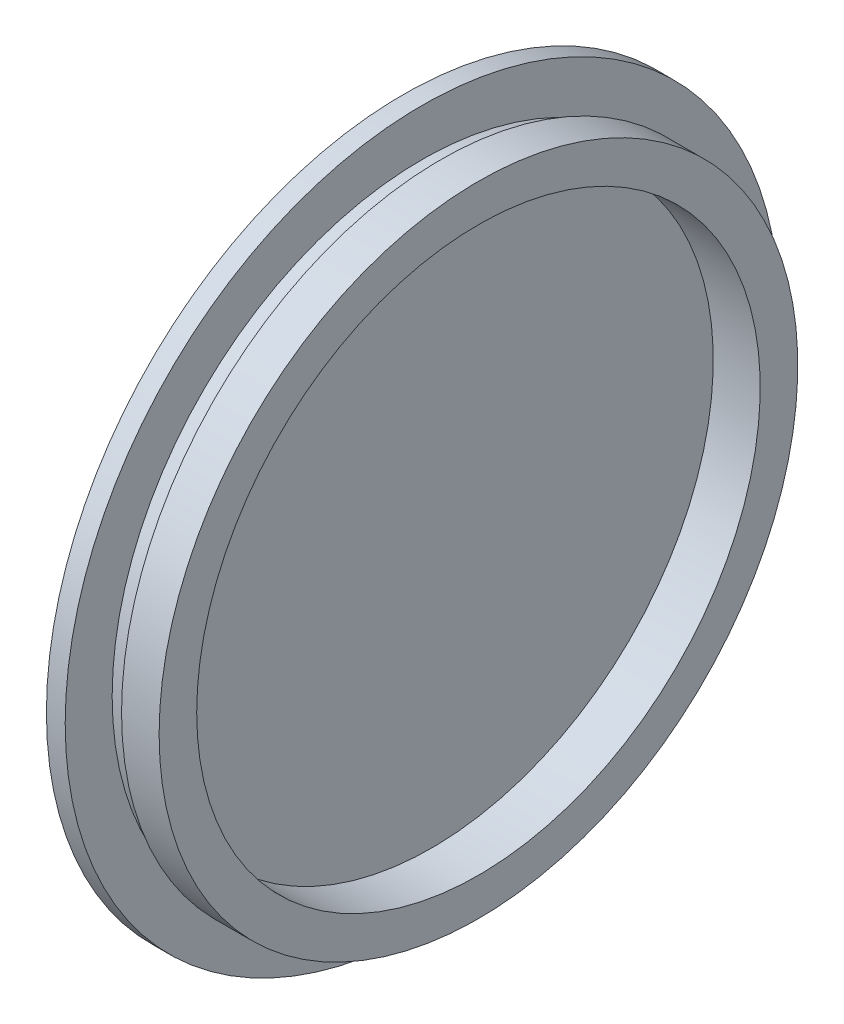
ISO-10303-21;
HEADER;
FILE_DESCRIPTION(('STEP AP214'),'2;1');
FILE_NAME('part.step','',(''),(''),'','','');
FILE_SCHEMA(('AUTOMOTIVE_DESIGN { 1 0 10303 214 1 1 1 1 }'));
ENDSEC;
DATA;
#1=APPLICATION_CONTEXT('core data for automotive mechanical design processes');
#2=APPLICATION_PROTOCOL_DEFINITION('international standard','automotive_design',2000,#1);
#3=PRODUCT_CONTEXT('',#1,'mechanical');
#4=PRODUCT('Part','Part','',(#3));
#5=PRODUCT_RELATED_PRODUCT_CATEGORY('part','',(#4));
#6=PRODUCT_DEFINITION_FORMATION('','',#4);
#7=PRODUCT_DEFINITION_CONTEXT('part definition',#1,'design');
#8=PRODUCT_DEFINITION('design','',#6,#7);
#9=PRODUCT_DEFINITION_SHAPE('','',#8);
#10=(LENGTH_UNIT() NAMED_UNIT(*) SI_UNIT(.MILLI.,.METRE.));
#11=(NAMED_UNIT(*) PLANE_ANGLE_UNIT() SI_UNIT($,.RADIAN.));
#12=(NAMED_UNIT(*) SI_UNIT($,.STERADIAN.) SOLID_ANGLE_UNIT());
#13=UNCERTAINTY_MEASURE_WITH_UNIT(LENGTH_MEASURE(1.E-05),#10,'distance_accuracy_value','');
#14=(GEOMETRIC_REPRESENTATION_CONTEXT(3) GLOBAL_UNCERTAINTY_ASSIGNED_CONTEXT((#13)) GLOBAL_UNIT_ASSIGNED_CONTEXT((#10,
#11,#12)) REPRESENTATION_CONTEXT('',''));
#15=CARTESIAN_POINT('',(0.,0.,0.));
#16=DIRECTION('',(0.,0.,1.));
#17=DIRECTION('',(1.,0.,0.));
#18=AXIS2_PLACEMENT_3D('',#15,#16,#17);
#19=CARTESIAN_POINT('',(0.,0.,0.));
#20=DIRECTION('',(1.,0.,0.));
#21=DIRECTION('',(0.,0.,-1.));
#22=AXIS2_PLACEMENT_3D('',#19,#20,#21);
#23=PLANE('',#22);
#24=CARTESIAN_POINT('',(0.,-10.,0.));
#25=DIRECTION('',(-1.,0.,0.));
#26=DIRECTION('',(0.,0.,1.));
#27=AXIS2_PLACEMENT_3D('',#24,#25,#26);
#28=CIRCLE('',#27,1.);
#29=CARTESIAN_POINT('',(0.,-10.,1.));
#30=VERTEX_POINT('',#29);
#31=EDGE_CURVE('E81',#30,#30,#28,.T.);
#32=ORIENTED_EDGE('',*,*,#31,.F.);
#33=EDGE_LOOP('',(#32));
#34=FACE_BOUND('',#33,.T.);
#35=CARTESIAN_POINT('',(0.,0.,10.));
#36=DIRECTION('',(-1.,0.,0.));
#37=DIRECTION('',(0.,0.,1.));
#38=AXIS2_PLACEMENT_3D('',#35,#36,#37);
#39=CIRCLE('',#38,1.);
#40=CARTESIAN_POINT('',(0.,0.,11.));
#41=VERTEX_POINT('',#40);
#42=EDGE_CURVE('E75',#41,#41,#39,.T.);
#43=ORIENTED_EDGE('',*,*,#42,.F.);
#44=EDGE_LOOP('',(#43));
#45=FACE_BOUND('',#44,.T.);
#46=CARTESIAN_POINT('',(0.,10.,0.));
#47=DIRECTION('',(-1.,0.,0.));
#48=DIRECTION('',(0.,0.,1.));
#49=AXIS2_PLACEMENT_3D('',#46,#47,#48);
#50=CIRCLE('',#49,1.);
#51=CARTESIAN_POINT('',(0.,10.,1.));
#52=VERTEX_POINT('',#51);
#53=EDGE_CURVE('E69',#52,#52,#50,.T.);
#54=ORIENTED_EDGE('',*,*,#53,.F.);
#55=EDGE_LOOP('',(#54));
#56=FACE_BOUND('',#55,.T.);
#57=CARTESIAN_POINT('',(0.,0.,-10.));
#58=DIRECTION('',(-1.,0.,0.));
#59=DIRECTION('',(0.,0.,1.));
#60=AXIS2_PLACEMENT_3D('',#57,#58,#59);
#61=CIRCLE('',#60,1.);
#62=CARTESIAN_POINT('',(0.,0.,-9.));
#63=VERTEX_POINT('',#62);
#64=EDGE_CURVE('E63',#63,#63,#61,.T.);
#65=ORIENTED_EDGE('',*,*,#64,.F.);
#66=EDGE_LOOP('',(#65));
#67=FACE_BOUND('',#66,.T.);
#68=CARTESIAN_POINT('',(0.,0.,0.));
#69=DIRECTION('',(-1.,0.,0.));
#70=DIRECTION('',(0.,0.,1.));
#71=AXIS2_PLACEMENT_3D('',#68,#69,#70);
#72=CIRCLE('',#71,19.);
#73=CARTESIAN_POINT('',(0.,0.,19.));
#74=VERTEX_POINT('',#73);
#75=EDGE_CURVE('E10',#74,#74,#72,.T.);
#76=ORIENTED_EDGE('',*,*,#75,.T.);
#77=EDGE_LOOP('',(#76));
#78=FACE_BOUND('',#77,.T.);
#79=ADVANCED_FACE('F31',(#34,#45,#56,#67,#78),#23,.F.);
#80=CARTESIAN_POINT('',(0.,0.,0.));
#81=DIRECTION('',(-1.,0.,0.));
#82=DIRECTION('',(0.,0.,1.));
#83=AXIS2_PLACEMENT_3D('',#80,#81,#82);
#84=CYLINDRICAL_SURFACE('',#83,19.);
#85=ORIENTED_EDGE('',*,*,#75,.F.);
#86=EDGE_LOOP('',(#85));
#87=FACE_BOUND('',#86,.T.);
#88=CARTESIAN_POINT('',(1.,0.,0.));
#89=DIRECTION('',(-1.,0.,0.));
#90=DIRECTION('',(0.,0.,1.));
#91=AXIS2_PLACEMENT_3D('',#88,#89,#90);
#92=CIRCLE('',#91,19.);
#93=CARTESIAN_POINT('',(1.,0.,19.));
#94=VERTEX_POINT('',#93);
#95=EDGE_CURVE('E37',#94,#94,#92,.T.);
#96=ORIENTED_EDGE('',*,*,#95,.T.);
#97=EDGE_LOOP('',(#96));
#98=FACE_BOUND('',#97,.T.);
#99=ADVANCED_FACE('F98',(#87,#98),#84,.T.);
#100=CARTESIAN_POINT('',(1.,19.,0.));
#101=DIRECTION('',(-1.,0.,0.));
#102=DIRECTION('',(0.,0.,1.));
#103=AXIS2_PLACEMENT_3D('',#100,#101,#102);
#104=PLANE('',#103);
#105=ORIENTED_EDGE('',*,*,#95,.F.);
#106=EDGE_LOOP('',(#105));
#107=FACE_BOUND('',#106,.T.);
#108=CARTESIAN_POINT('',(1.,0.,0.));
#109=DIRECTION('',(-1.,0.,0.));
#110=DIRECTION('',(0.,0.,1.));
#111=AXIS2_PLACEMENT_3D('',#108,#109,#110);
#112=CIRCLE('',#111,16.5);
#113=CARTESIAN_POINT('',(1.,0.,16.5));
#114=VERTEX_POINT('',#113);
#115=EDGE_CURVE('E41',#114,#114,#112,.T.);
#116=ORIENTED_EDGE('',*,*,#115,.T.);
#117=EDGE_LOOP('',(#116));
#118=FACE_BOUND('',#117,.T.);
#119=ADVANCED_FACE('F142',(#107,#118),#104,.F.);
#120=CARTESIAN_POINT('',(0.,0.,0.));
#121=DIRECTION('',(-1.,0.,0.));
#122=DIRECTION('',(0.,0.,1.));
#123=AXIS2_PLACEMENT_3D('',#120,#121,#122);
#124=CYLINDRICAL_SURFACE('',#123,16.5);
#125=ORIENTED_EDGE('',*,*,#115,.F.);
#126=EDGE_LOOP('',(#125));
#127=FACE_BOUND('',#126,.T.);
#128=CARTESIAN_POINT('',(2.,0.,0.));
#129=DIRECTION('',(-1.,0.,0.));
#130=DIRECTION('',(0.,0.,1.));
#131=AXIS2_PLACEMENT_3D('',#128,#129,#130);
#132=CIRCLE('',#131,16.5);
#133=CARTESIAN_POINT('',(2.,0.,16.5));
#134=VERTEX_POINT('',#133);
#135=EDGE_CURVE('E45',#134,#134,#132,.T.);
#136=ORIENTED_EDGE('',*,*,#135,.T.);
#137=EDGE_LOOP('',(#136));
#138=FACE_BOUND('',#137,.T.);
#139=ADVANCED_FACE('F138',(#127,#138),#124,.T.);
#140=CARTESIAN_POINT('',(2.,16.5,0.));
#141=DIRECTION('',(1.,0.,0.));
#142=DIRECTION('',(0.,0.,-1.));
#143=AXIS2_PLACEMENT_3D('',#140,#141,#142);
#144=PLANE('',#143);
#145=ORIENTED_EDGE('',*,*,#135,.F.);
#146=EDGE_LOOP('',(#145));
#147=FACE_BOUND('',#146,.T.);
#148=CARTESIAN_POINT('',(2.,0.,0.));
#149=DIRECTION('',(-1.,0.,0.));
#150=DIRECTION('',(0.,0.,1.));
#151=AXIS2_PLACEMENT_3D('',#148,#149,#150);
#152=CIRCLE('',#151,17.);
#153=CARTESIAN_POINT('',(2.,0.,17.));
#154=VERTEX_POINT('',#153);
#155=EDGE_CURVE('E50',#154,#154,#152,.T.);
#156=ORIENTED_EDGE('',*,*,#155,.T.);
#157=EDGE_LOOP('',(#156));
#158=FACE_BOUND('',#157,.T.);
#159=ADVANCED_FACE('F134',(#147,#158),#144,.F.);
#160=CARTESIAN_POINT('',(0.,0.,0.));
#161=DIRECTION('',(-1.,0.,0.));
#162=DIRECTION('',(0.,0.,1.));
#163=AXIS2_PLACEMENT_3D('',#160,#161,#162);
#164=CYLINDRICAL_SURFACE('',#163,17.);
#165=ORIENTED_EDGE('',*,*,#155,.F.);
#166=EDGE_LOOP('',(#165));
#167=FACE_BOUND('',#166,.T.);
#168=CARTESIAN_POINT('',(4.,0.,0.));
#169=DIRECTION('',(-1.,0.,0.));
#170=DIRECTION('',(0.,0.,1.));
#171=AXIS2_PLACEMENT_3D('',#168,#169,#170);
#172=CIRCLE('',#171,17.);
#173=CARTESIAN_POINT('',(4.,0.,17.));
#174=VERTEX_POINT('',#173);
#175=EDGE_CURVE('E53',#174,#174,#172,.T.);
#176=ORIENTED_EDGE('',*,*,#175,.T.);
#177=EDGE_LOOP('',(#176));
#178=FACE_BOUND('',#177,.T.);
#179=ADVANCED_FACE('F130',(#167,#178),#164,.T.);
#180=CARTESIAN_POINT('',(4.,17.,0.));
#181=DIRECTION('',(-1.,0.,0.));
#182=DIRECTION('',(0.,0.,1.));
#183=AXIS2_PLACEMENT_3D('',#180,#181,#182);
#184=PLANE('',#183);
#185=ORIENTED_EDGE('',*,*,#175,.F.);
#186=EDGE_LOOP('',(#185));
#187=FACE_BOUND('',#186,.T.);
#188=CARTESIAN_POINT('',(4.,0.,0.));
#189=DIRECTION('',(-1.,0.,0.));
#190=DIRECTION('',(0.,0.,1.));
#191=AXIS2_PLACEMENT_3D('',#188,#189,#190);
#192=CIRCLE('',#191,15.);
#193=CARTESIAN_POINT('',(4.,0.,15.));
#194=VERTEX_POINT('',#193);
#195=EDGE_CURVE('E56',#194,#194,#192,.T.);
#196=ORIENTED_EDGE('',*,*,#195,.T.);
#197=EDGE_LOOP('',(#196));
#198=FACE_BOUND('',#197,.T.);
#199=ADVANCED_FACE('F126',(#187,#198),#184,.F.);
#200=CARTESIAN_POINT('',(0.,0.,0.));
#201=DIRECTION('',(-1.,0.,0.));
#202=DIRECTION('',(0.,0.,1.));
#203=AXIS2_PLACEMENT_3D('',#200,#201,#202);
#204=CYLINDRICAL_SURFACE('',#203,15.);
#205=ORIENTED_EDGE('',*,*,#195,.F.);
#206=EDGE_LOOP('',(#205));
#207=FACE_BOUND('',#206,.T.);
#208=CARTESIAN_POINT('',(1.5,0.,0.));
#209=DIRECTION('',(-1.,0.,0.));
#210=DIRECTION('',(0.,0.,1.));
#211=AXIS2_PLACEMENT_3D('',#208,#209,#210);
#212=CIRCLE('',#211,15.);
#213=CARTESIAN_POINT('',(1.5,0.,15.));
#214=VERTEX_POINT('',#213);
#215=EDGE_CURVE('E59',#214,#214,#212,.T.);
#216=ORIENTED_EDGE('',*,*,#215,.T.);
#217=EDGE_LOOP('',(#216));
#218=FACE_BOUND('',#217,.T.);
#219=ADVANCED_FACE('F118',(#207,#218),#204,.F.);
#220=CARTESIAN_POINT('',(1.5,0.,0.));
#221=DIRECTION('',(-1.,0.,0.));
#222=DIRECTION('',(0.,0.,1.));
#223=AXIS2_PLACEMENT_3D('',#220,#221,#222);
#224=PLANE('',#223);
#225=ORIENTED_EDGE('',*,*,#215,.F.);
#226=EDGE_LOOP('',(#225));
#227=FACE_BOUND('',#226,.T.);
#228=ADVANCED_FACE('F108',(#227),#224,.F.);
#229=CARTESIAN_POINT('',(1.,0.,-10.));
#230=DIRECTION('',(-1.,0.,0.));
#231=DIRECTION('',(0.,0.,1.));
#232=AXIS2_PLACEMENT_3D('',#229,#230,#231);
#233=CYLINDRICAL_SURFACE('',#232,1.);
#234=CARTESIAN_POINT('',(1.,0.,-10.));
#235=DIRECTION('',(-1.,0.,0.));
#236=DIRECTION('',(0.,0.,1.));
#237=AXIS2_PLACEMENT_3D('',#234,#235,#236);
#238=CIRCLE('',#237,1.);
#239=CARTESIAN_POINT('',(1.,0.,-9.));
#240=VERTEX_POINT('',#239);
#241=EDGE_CURVE('E62',#240,#240,#238,.T.);
#242=ORIENTED_EDGE('',*,*,#241,.F.);
#243=EDGE_LOOP('',(#242));
#244=FACE_BOUND('',#243,.T.);
#245=ORIENTED_EDGE('',*,*,#64,.T.);
#246=EDGE_LOOP('',(#245));
#247=FACE_BOUND('',#246,.T.);
#248=ADVANCED_FACE('F105',(#244,#247),#233,.F.);
#249=CARTESIAN_POINT('',(1.,0.,-10.));
#250=DIRECTION('',(-1.,0.,0.));
#251=DIRECTION('',(0.,0.,1.));
#252=AXIS2_PLACEMENT_3D('',#249,#250,#251);
#253=PLANE('',#252);
#254=ORIENTED_EDGE('',*,*,#241,.T.);
#255=EDGE_LOOP('',(#254));
#256=FACE_BOUND('',#255,.T.);
#257=ADVANCED_FACE('F107',(#256),#253,.T.);
#258=CARTESIAN_POINT('',(1.,10.,0.));
#259=DIRECTION('',(-1.,0.,0.));
#260=DIRECTION('',(0.,0.,1.));
#261=AXIS2_PLACEMENT_3D('',#258,#259,#260);
#262=CYLINDRICAL_SURFACE('',#261,1.);
#263=CARTESIAN_POINT('',(1.,10.,0.));
#264=DIRECTION('',(-1.,0.,0.));
#265=DIRECTION('',(0.,0.,1.));
#266=AXIS2_PLACEMENT_3D('',#263,#264,#265);
#267=CIRCLE('',#266,1.);
#268=CARTESIAN_POINT('',(1.,10.,1.));
#269=VERTEX_POINT('',#268);
#270=EDGE_CURVE('E66',#269,#269,#267,.T.);
#271=ORIENTED_EDGE('',*,*,#270,.F.);
#272=EDGE_LOOP('',(#271));
#273=FACE_BOUND('',#272,.T.);
#274=ORIENTED_EDGE('',*,*,#53,.T.);
#275=EDGE_LOOP('',(#274));
#276=FACE_BOUND('',#275,.T.);
#277=ADVANCED_FACE('F115',(#273,#276),#262,.F.);
#278=CARTESIAN_POINT('',(1.,10.,0.));
#279=DIRECTION('',(-1.,0.,0.));
#280=DIRECTION('',(0.,0.,1.));
#281=AXIS2_PLACEMENT_3D('',#278,#279,#280);
#282=PLANE('',#281);
#283=ORIENTED_EDGE('',*,*,#270,.T.);
#284=EDGE_LOOP('',(#283));
#285=FACE_BOUND('',#284,.T.);
#286=ADVANCED_FACE('F203',(#285),#282,.T.);
#287=CARTESIAN_POINT('',(1.,0.,10.));
#288=DIRECTION('',(-1.,0.,0.));
#289=DIRECTION('',(0.,0.,1.));
#290=AXIS2_PLACEMENT_3D('',#287,#288,#289);
#291=CYLINDRICAL_SURFACE('',#290,1.);
#292=CARTESIAN_POINT('',(1.,0.,10.));
#293=DIRECTION('',(-1.,0.,0.));
#294=DIRECTION('',(0.,0.,1.));
#295=AXIS2_PLACEMENT_3D('',#292,#293,#294);
#296=CIRCLE('',#295,1.);
#297=CARTESIAN_POINT('',(1.,0.,11.));
#298=VERTEX_POINT('',#297);
#299=EDGE_CURVE('E72',#298,#298,#296,.T.);
#300=ORIENTED_EDGE('',*,*,#299,.F.);
#301=EDGE_LOOP('',(#300));
#302=FACE_BOUND('',#301,.T.);
#303=ORIENTED_EDGE('',*,*,#42,.T.);
#304=EDGE_LOOP('',(#303));
#305=FACE_BOUND('',#304,.T.);
#306=ADVANCED_FACE('F212',(#302,#305),#291,.F.);
#307=CARTESIAN_POINT('',(1.,0.,10.));
#308=DIRECTION('',(-1.,0.,0.));
#309=DIRECTION('',(0.,0.,1.));
#310=AXIS2_PLACEMENT_3D('',#307,#308,#309);
#311=PLANE('',#310);
#312=ORIENTED_EDGE('',*,*,#299,.T.);
#313=EDGE_LOOP('',(#312));
#314=FACE_BOUND('',#313,.T.);
#315=ADVANCED_FACE('F92',(#314),#311,.T.);
#316=CARTESIAN_POINT('',(1.,-10.,0.));
#317=DIRECTION('',(-1.,0.,0.));
#318=DIRECTION('',(0.,0.,1.));
#319=AXIS2_PLACEMENT_3D('',#316,#317,#318);
#320=CYLINDRICAL_SURFACE('',#319,1.);
#321=CARTESIAN_POINT('',(1.,-10.,0.));
#322=DIRECTION('',(-1.,0.,0.));
#323=DIRECTION('',(0.,0.,1.));
#324=AXIS2_PLACEMENT_3D('',#321,#322,#323);
#325=CIRCLE('',#324,1.);
#326=CARTESIAN_POINT('',(1.,-10.,1.));
#327=VERTEX_POINT('',#326);
#328=EDGE_CURVE('E78',#327,#327,#325,.T.);
#329=ORIENTED_EDGE('',*,*,#328,.F.);
#330=EDGE_LOOP('',(#329));
#331=FACE_BOUND('',#330,.T.);
#332=ORIENTED_EDGE('',*,*,#31,.T.);
#333=EDGE_LOOP('',(#332));
#334=FACE_BOUND('',#333,.T.);
#335=ADVANCED_FACE('F89',(#331,#334),#320,.F.);
#336=CARTESIAN_POINT('',(1.,-10.,0.));
#337=DIRECTION('',(-1.,0.,0.));
#338=DIRECTION('',(0.,0.,1.));
#339=AXIS2_PLACEMENT_3D('',#336,#337,#338);
#340=PLANE('',#339);
#341=ORIENTED_EDGE('',*,*,#328,.T.);
#342=EDGE_LOOP('',(#341));
#343=FACE_BOUND('',#342,.T.);
#344=ADVANCED_FACE('F87',(#343),#340,.T.);
#345=CLOSED_SHELL('',(#79,#99,#119,#139,#159,#179,#199,#219,#228,#248,#257,#277,#286,#306,#315,
#335,#344));
#346=MANIFOLD_SOLID_BREP('B2',#345);
#347=ADVANCED_BREP_SHAPE_REPRESENTATION('',(#18,#346),#14);
#348=SHAPE_DEFINITION_REPRESENTATION(#9,#347);
ENDSEC;
END-ISO-10303-21;
